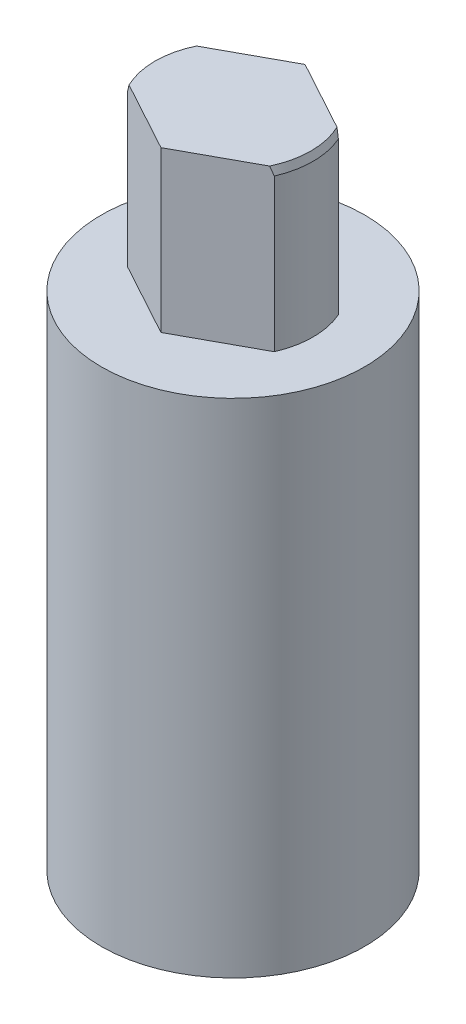
ISO-10303-21;
HEADER;
FILE_DESCRIPTION(('STEP AP214'),'2;1');
FILE_NAME('part.step','',(''),(''),'','','');
FILE_SCHEMA(('AUTOMOTIVE_DESIGN { 1 0 10303 214 1 1 1 1 }'));
ENDSEC;
DATA;
#1=APPLICATION_CONTEXT('core data for automotive mechanical design processes');
#2=APPLICATION_PROTOCOL_DEFINITION('international standard','automotive_design',2000,#1);
#3=PRODUCT_CONTEXT('',#1,'mechanical');
#4=PRODUCT('Part','Part','',(#3));
#5=PRODUCT_RELATED_PRODUCT_CATEGORY('part','',(#4));
#6=PRODUCT_DEFINITION_FORMATION('','',#4);
#7=PRODUCT_DEFINITION_CONTEXT('part definition',#1,'design');
#8=PRODUCT_DEFINITION('design','',#6,#7);
#9=PRODUCT_DEFINITION_SHAPE('','',#8);
#10=(LENGTH_UNIT() NAMED_UNIT(*) SI_UNIT(.MILLI.,.METRE.));
#11=(NAMED_UNIT(*) PLANE_ANGLE_UNIT() SI_UNIT($,.RADIAN.));
#12=(NAMED_UNIT(*) SI_UNIT($,.STERADIAN.) SOLID_ANGLE_UNIT());
#13=UNCERTAINTY_MEASURE_WITH_UNIT(LENGTH_MEASURE(1.E-05),#10,'distance_accuracy_value','');
#14=(GEOMETRIC_REPRESENTATION_CONTEXT(3) GLOBAL_UNCERTAINTY_ASSIGNED_CONTEXT((#13)) GLOBAL_UNIT_ASSIGNED_CONTEXT((#10,
#11,#12)) REPRESENTATION_CONTEXT('',''));
#15=CARTESIAN_POINT('',(0.,0.,0.));
#16=DIRECTION('',(0.,0.,1.));
#17=DIRECTION('',(1.,0.,0.));
#18=AXIS2_PLACEMENT_3D('',#15,#16,#17);
#19=CARTESIAN_POINT('',(0.,20.174241,0.));
#20=DIRECTION('',(0.,-1.,0.));
#21=DIRECTION('',(0.,0.,-1.));
#22=AXIS2_PLACEMENT_3D('',#19,#20,#21);
#23=CYLINDRICAL_SURFACE('',#22,10.0871205);
#24=DIRECTION('',(0.,1.,0.));
#25=VECTOR('',#24,1.);
#26=CARTESIAN_POINT('',(-9.24499864707816,0.,-4.0348482));
#27=LINE('',#26,#25);
#28=CARTESIAN_POINT('',(-9.24499864707816,0.,-4.0348482));
#29=VERTEX_POINT('',#28);
#30=CARTESIAN_POINT('',(-9.24499864707816,19.174241,-4.0348482));
#31=VERTEX_POINT('',#30);
#32=EDGE_CURVE('E131',#29,#31,#27,.T.);
#33=ORIENTED_EDGE('',*,*,#32,.F.);
#34=CARTESIAN_POINT('',(0.,0.,0.));
#35=DIRECTION('',(0.,-1.,0.));
#36=DIRECTION('',(0.,0.,-1.));
#37=AXIS2_PLACEMENT_3D('',#34,#35,#36);
#38=CIRCLE('',#37,10.0871205);
#39=CARTESIAN_POINT('',(-9.24499864707816,0.,4.0348482));
#40=VERTEX_POINT('',#39);
#41=EDGE_CURVE('E125',#40,#29,#38,.T.);
#42=ORIENTED_EDGE('',*,*,#41,.F.);
#43=DIRECTION('',(0.,1.,0.));
#44=VECTOR('',#43,1.);
#45=CARTESIAN_POINT('',(-9.24499864707816,0.,4.0348482));
#46=LINE('',#45,#44);
#47=CARTESIAN_POINT('',(-9.24499864707816,19.174241,4.0348482));
#48=VERTEX_POINT('',#47);
#49=EDGE_CURVE('E108',#40,#48,#46,.T.);
#50=ORIENTED_EDGE('',*,*,#49,.T.);
#51=CARTESIAN_POINT('',(0.,19.174241,0.));
#52=DIRECTION('',(0.,1.,0.));
#53=DIRECTION('',(0.,0.,1.));
#54=AXIS2_PLACEMENT_3D('',#51,#52,#53);
#55=CIRCLE('',#54,10.0871205);
#56=EDGE_CURVE('E145',#48,#31,#55,.F.);
#57=ORIENTED_EDGE('',*,*,#56,.T.);
#58=EDGE_LOOP('',(#33,#42,#50,#57));
#59=FACE_BOUND('',#58,.T.);
#60=ADVANCED_FACE('F38',(#59),#23,.T.);
#61=DIRECTION('',(0.,1.,0.));
#62=VECTOR('',#61,1.);
#63=CARTESIAN_POINT('',(9.24499864707816,0.,-4.0348482));
#64=LINE('',#63,#62);
#65=CARTESIAN_POINT('',(9.24499864707816,0.,-4.0348482));
#66=VERTEX_POINT('',#65);
#67=CARTESIAN_POINT('',(9.24499864707816,19.174241,-4.0348482));
#68=VERTEX_POINT('',#67);
#69=EDGE_CURVE('E191',#66,#68,#64,.T.);
#70=ORIENTED_EDGE('',*,*,#69,.T.);
#71=CARTESIAN_POINT('',(9.24499864707816,19.174241,4.0348482));
#72=VERTEX_POINT('',#71);
#73=EDGE_CURVE('E144',#68,#72,#55,.F.);
#74=ORIENTED_EDGE('',*,*,#73,.T.);
#75=DIRECTION('',(0.,1.,0.));
#76=VECTOR('',#75,1.);
#77=CARTESIAN_POINT('',(9.24499864707816,0.,4.0348482));
#78=LINE('',#77,#76);
#79=CARTESIAN_POINT('',(9.24499864707816,0.,4.0348482));
#80=VERTEX_POINT('',#79);
#81=EDGE_CURVE('E197',#80,#72,#78,.T.);
#82=ORIENTED_EDGE('',*,*,#81,.F.);
#83=EDGE_CURVE('E132',#66,#80,#38,.T.);
#84=ORIENTED_EDGE('',*,*,#83,.F.);
#85=EDGE_LOOP('',(#70,#74,#82,#84));
#86=FACE_BOUND('',#85,.T.);
#87=ADVANCED_FACE('F179',(#86),#23,.T.);
#88=CARTESIAN_POINT('',(0.,20.174241,0.));
#89=DIRECTION('',(0.,1.,0.));
#90=DIRECTION('',(0.,0.,1.));
#91=AXIS2_PLACEMENT_3D('',#88,#89,#90);
#92=PLANE('',#91);
#93=DIRECTION('',(-0.877862290928858,0.,-0.478913142610576));
#94=VECTOR('',#93,1.);
#95=CARTESIAN_POINT('',(9.24499864707816,20.174241,-4.0348482));
#96=LINE('',#95,#94);
#97=CARTESIAN_POINT('',(8.85216261350672,20.174241,-4.24915782613659));
#98=VERTEX_POINT('',#97);
#99=CARTESIAN_POINT('',(0.,20.174241,-9.07840845));
#100=VERTEX_POINT('',#99);
#101=EDGE_CURVE('E67',#98,#100,#96,.T.);
#102=ORIENTED_EDGE('',*,*,#101,.T.);
#103=DIRECTION('',(-0.877862290928858,0.,0.478913142610576));
#104=VECTOR('',#103,1.);
#105=CARTESIAN_POINT('',(-9.24499864707816,20.174241,-4.0348482));
#106=LINE('',#105,#104);
#107=CARTESIAN_POINT('',(-8.85216261350673,20.174241,-4.24915782613658));
#108=VERTEX_POINT('',#107);
#109=EDGE_CURVE('E128',#100,#108,#106,.T.);
#110=ORIENTED_EDGE('',*,*,#109,.T.);
#111=CARTESIAN_POINT('',(0.,20.174241,0.));
#112=DIRECTION('',(0.,1.,0.));
#113=DIRECTION('',(0.,0.,1.));
#114=AXIS2_PLACEMENT_3D('',#111,#112,#113);
#115=CIRCLE('',#114,9.81917130756888);
#116=CARTESIAN_POINT('',(-8.85216261350673,20.174241,4.24915782613659));
#117=VERTEX_POINT('',#116);
#118=EDGE_CURVE('E135',#108,#117,#115,.T.);
#119=ORIENTED_EDGE('',*,*,#118,.T.);
#120=DIRECTION('',(0.877862290928858,0.,0.478913142610576));
#121=VECTOR('',#120,1.);
#122=CARTESIAN_POINT('',(0.,20.174241,9.07840845));
#123=LINE('',#122,#121);
#124=CARTESIAN_POINT('',(0.,20.174241,9.07840845));
#125=VERTEX_POINT('',#124);
#126=EDGE_CURVE('E59',#117,#125,#123,.T.);
#127=ORIENTED_EDGE('',*,*,#126,.T.);
#128=DIRECTION('',(0.877862290928858,0.,-0.478913142610576));
#129=VECTOR('',#128,1.);
#130=CARTESIAN_POINT('',(0.,20.174241,9.07840845));
#131=LINE('',#130,#129);
#132=CARTESIAN_POINT('',(8.85216261350672,20.174241,4.24915782613659));
#133=VERTEX_POINT('',#132);
#134=EDGE_CURVE('E224',#125,#133,#131,.T.);
#135=ORIENTED_EDGE('',*,*,#134,.T.);
#136=EDGE_CURVE('E141',#133,#98,#115,.T.);
#137=ORIENTED_EDGE('',*,*,#136,.T.);
#138=EDGE_LOOP('',(#102,#110,#119,#127,#135,#137));
#139=FACE_BOUND('',#138,.T.);
#140=ADVANCED_FACE('F177',(#139),#92,.T.);
#141=CARTESIAN_POINT('',(0.,20.174241,0.));
#142=DIRECTION('',(0.,-1.,0.));
#143=DIRECTION('',(0.,0.,-1.));
#144=AXIS2_PLACEMENT_3D('',#141,#142,#143);
#145=CONICAL_SURFACE('',#144,9.81917130756888,0.261799387799152);
#146=ORIENTED_EDGE('',*,*,#118,.F.);
#147=CARTESIAN_POINT('',(-8.85208207999155,20.174441,-4.24920176077102));
#148=CARTESIAN_POINT('',(-8.91889550438962,20.0083777009909,-4.21275204949205));
#149=CARTESIAN_POINT('',(-8.98505166783165,19.8419793620903,-4.17666090346098));
#150=CARTESIAN_POINT('',(-9.1160494372309,19.5085126950598,-4.10519576130117));
#151=CARTESIAN_POINT('',(-9.18089104390203,19.3414443672938,-4.06982176478295));
#152=CARTESIAN_POINT('',(-9.24507539033106,19.1740410000003,-4.03480633312316));
#153=B_SPLINE_CURVE_WITH_KNOTS('',3,(#147,#148,#149,#150,#151,#152),.UNSPECIFIED.,.F.,.F.,(4,2,
4),(0.,0.548004145740498,1.09600799385742),.UNSPECIFIED.);
#154=EDGE_CURVE('E12',#108,#31,#153,.T.);
#155=ORIENTED_EDGE('',*,*,#154,.T.);
#156=ORIENTED_EDGE('',*,*,#56,.F.);
#157=CARTESIAN_POINT('',(-9.24507539033058,19.174041,4.03480633312342));
#158=CARTESIAN_POINT('',(-9.1808910439017,19.3414443672936,4.06982176478313));
#159=CARTESIAN_POINT('',(-9.11604943723073,19.5085126950597,4.10519576130126));
#160=CARTESIAN_POINT('',(-8.98505166783183,19.8419793620903,4.17666090346089));
#161=CARTESIAN_POINT('',(-8.91889550438998,20.0083777009911,4.21275204949186));
#162=CARTESIAN_POINT('',(-8.8520820799921,20.1744410000003,4.24920176077072));
#163=B_SPLINE_CURVE_WITH_KNOTS('',3,(#157,#158,#159,#160,#161,#162),.UNSPECIFIED.,.F.,.F.,(4,2,
4),(0.,0.54800384811692,1.09600799385742),.UNSPECIFIED.);
#164=EDGE_CURVE('E112',#48,#117,#163,.T.);
#165=ORIENTED_EDGE('',*,*,#164,.T.);
#166=EDGE_LOOP('',(#146,#155,#156,#165));
#167=FACE_BOUND('',#166,.T.);
#168=ADVANCED_FACE('F40',(#167),#145,.T.);
#169=ORIENTED_EDGE('',*,*,#73,.F.);
#170=CARTESIAN_POINT('',(9.24507539033058,19.174041,-4.03480633312342));
#171=CARTESIAN_POINT('',(9.1808910439017,19.3414443672936,-4.06982176478314));
#172=CARTESIAN_POINT('',(9.11604943723073,19.5085126950597,-4.10519576130127));
#173=CARTESIAN_POINT('',(8.98505166783182,19.8419793620904,-4.17666090346089));
#174=CARTESIAN_POINT('',(8.91889550438997,20.0083777009911,-4.21275204949186));
#175=CARTESIAN_POINT('',(8.8520820799921,20.1744410000003,-4.24920176077072));
#176=B_SPLINE_CURVE_WITH_KNOTS('',3,(#170,#171,#172,#173,#174,#175),.UNSPECIFIED.,.F.,.F.,(4,2,
4),(0.,0.548003848116923,1.09600799385741),.UNSPECIFIED.);
#177=EDGE_CURVE('E52',#68,#98,#176,.T.);
#178=ORIENTED_EDGE('',*,*,#177,.T.);
#179=ORIENTED_EDGE('',*,*,#136,.F.);
#180=CARTESIAN_POINT('',(8.85208207999155,20.174441,4.24920176077103));
#181=CARTESIAN_POINT('',(8.91889550438962,20.0083777009909,4.21275204949206));
#182=CARTESIAN_POINT('',(8.98505166783165,19.8419793620903,4.17666090346099));
#183=CARTESIAN_POINT('',(9.1160494372309,19.5085126950598,4.10519576130117));
#184=CARTESIAN_POINT('',(9.18089104390203,19.3414443672938,4.06982176478296));
#185=CARTESIAN_POINT('',(9.24507539033106,19.1740410000003,4.03480633312316));
#186=B_SPLINE_CURVE_WITH_KNOTS('',3,(#180,#181,#182,#183,#184,#185),.UNSPECIFIED.,.F.,.F.,(4,2,
4),(0.,0.548004145740498,1.09600799385742),.UNSPECIFIED.);
#187=EDGE_CURVE('E153',#133,#72,#186,.T.);
#188=ORIENTED_EDGE('',*,*,#187,.T.);
#189=EDGE_LOOP('',(#169,#178,#179,#188));
#190=FACE_BOUND('',#189,.T.);
#191=ADVANCED_FACE('F172',(#190),#145,.T.);
#192=CARTESIAN_POINT('',(0.,0.,0.));
#193=DIRECTION('',(0.,-1.,0.));
#194=DIRECTION('',(0.,0.,-1.));
#195=AXIS2_PLACEMENT_3D('',#192,#193,#194);
#196=PLANE('',#195);
#197=CARTESIAN_POINT('',(0.,0.,0.));
#198=DIRECTION('',(0.,-1.,0.));
#199=DIRECTION('',(0.,0.,-1.));
#200=AXIS2_PLACEMENT_3D('',#197,#198,#199);
#201=CIRCLE('',#200,16.5871205);
#202=CARTESIAN_POINT('',(0.,0.,-16.5871205));
#203=VERTEX_POINT('',#202);
#204=EDGE_CURVE('E137',#203,#203,#201,.T.);
#205=ORIENTED_EDGE('',*,*,#204,.F.);
#206=EDGE_LOOP('',(#205));
#207=FACE_BOUND('',#206,.T.);
#208=ORIENTED_EDGE('',*,*,#83,.T.);
#209=DIRECTION('',(0.877862290928858,0.,-0.478913142610576));
#210=VECTOR('',#209,1.);
#211=CARTESIAN_POINT('',(0.,0.,9.07840845));
#212=LINE('',#211,#210);
#213=CARTESIAN_POINT('',(0.,0.,9.07840845));
#214=VERTEX_POINT('',#213);
#215=EDGE_CURVE('E126',#214,#80,#212,.T.);
#216=ORIENTED_EDGE('',*,*,#215,.F.);
#217=DIRECTION('',(0.877862290928858,0.,0.478913142610576));
#218=VECTOR('',#217,1.);
#219=CARTESIAN_POINT('',(0.,0.,9.07840845));
#220=LINE('',#219,#218);
#221=EDGE_CURVE('E111',#40,#214,#220,.T.);
#222=ORIENTED_EDGE('',*,*,#221,.F.);
#223=ORIENTED_EDGE('',*,*,#41,.T.);
#224=DIRECTION('',(-0.877862290928858,0.,0.478913142610576));
#225=VECTOR('',#224,1.);
#226=CARTESIAN_POINT('',(-9.24499864707816,0.,-4.0348482));
#227=LINE('',#226,#225);
#228=CARTESIAN_POINT('',(0.,0.,-9.07840845));
#229=VERTEX_POINT('',#228);
#230=EDGE_CURVE('E118',#229,#29,#227,.T.);
#231=ORIENTED_EDGE('',*,*,#230,.F.);
#232=DIRECTION('',(-0.877862290928858,0.,-0.478913142610576));
#233=VECTOR('',#232,1.);
#234=CARTESIAN_POINT('',(9.24499864707816,0.,-4.0348482));
#235=LINE('',#234,#233);
#236=EDGE_CURVE('E234',#66,#229,#235,.T.);
#237=ORIENTED_EDGE('',*,*,#236,.F.);
#238=EDGE_LOOP('',(#208,#216,#222,#223,#231,#237));
#239=FACE_BOUND('',#238,.T.);
#240=ADVANCED_FACE('F123',(#207,#239),#196,.F.);
#241=CARTESIAN_POINT('',(0.,-63.26,0.));
#242=DIRECTION('',(0.,1.,0.));
#243=DIRECTION('',(0.,0.,1.));
#244=AXIS2_PLACEMENT_3D('',#241,#242,#243);
#245=CYLINDRICAL_SURFACE('',#244,16.5871205);
#246=CARTESIAN_POINT('',(0.,-63.26,0.));
#247=DIRECTION('',(0.,-1.,0.));
#248=DIRECTION('',(0.,0.,-1.));
#249=AXIS2_PLACEMENT_3D('',#246,#247,#248);
#250=CIRCLE('',#249,16.5871205);
#251=CARTESIAN_POINT('',(0.,-63.26,-16.5871205));
#252=VERTEX_POINT('',#251);
#253=EDGE_CURVE('E133',#252,#252,#250,.T.);
#254=ORIENTED_EDGE('',*,*,#253,.F.);
#255=EDGE_LOOP('',(#254));
#256=FACE_BOUND('',#255,.T.);
#257=ORIENTED_EDGE('',*,*,#204,.T.);
#258=EDGE_LOOP('',(#257));
#259=FACE_BOUND('',#258,.T.);
#260=ADVANCED_FACE('F168',(#256,#259),#245,.T.);
#261=CARTESIAN_POINT('',(0.,-63.26,0.));
#262=DIRECTION('',(0.,-1.,0.));
#263=DIRECTION('',(0.,0.,-1.));
#264=AXIS2_PLACEMENT_3D('',#261,#262,#263);
#265=PLANE('',#264);
#266=ORIENTED_EDGE('',*,*,#253,.T.);
#267=EDGE_LOOP('',(#266));
#268=FACE_BOUND('',#267,.T.);
#269=ADVANCED_FACE('F163',(#268),#265,.T.);
#270=CARTESIAN_POINT('',(0.,0.,9.07840845));
#271=DIRECTION('',(-0.478913142610576,0.,0.877862290928858));
#272=DIRECTION('',(0.877862290928858,0.,0.478913142610576));
#273=AXIS2_PLACEMENT_3D('',#270,#271,#272);
#274=PLANE('',#273);
#275=ORIENTED_EDGE('',*,*,#49,.F.);
#276=ORIENTED_EDGE('',*,*,#221,.T.);
#277=DIRECTION('',(0.,1.,0.));
#278=VECTOR('',#277,1.);
#279=CARTESIAN_POINT('',(0.,0.,9.07840845));
#280=LINE('',#279,#278);
#281=EDGE_CURVE('E117',#214,#125,#280,.T.);
#282=ORIENTED_EDGE('',*,*,#281,.T.);
#283=ORIENTED_EDGE('',*,*,#126,.F.);
#284=ORIENTED_EDGE('',*,*,#164,.F.);
#285=EDGE_LOOP('',(#275,#276,#282,#283,#284));
#286=FACE_BOUND('',#285,.T.);
#287=ADVANCED_FACE('F110',(#286),#274,.T.);
#288=CARTESIAN_POINT('',(0.,0.,9.07840845));
#289=DIRECTION('',(0.478913142610576,0.,0.877862290928858));
#290=DIRECTION('',(0.877862290928858,0.,-0.478913142610576));
#291=AXIS2_PLACEMENT_3D('',#288,#289,#290);
#292=PLANE('',#291);
#293=ORIENTED_EDGE('',*,*,#134,.F.);
#294=ORIENTED_EDGE('',*,*,#281,.F.);
#295=ORIENTED_EDGE('',*,*,#215,.T.);
#296=ORIENTED_EDGE('',*,*,#81,.T.);
#297=ORIENTED_EDGE('',*,*,#187,.F.);
#298=EDGE_LOOP('',(#293,#294,#295,#296,#297));
#299=FACE_BOUND('',#298,.T.);
#300=ADVANCED_FACE('F162',(#299),#292,.T.);
#301=CARTESIAN_POINT('',(-9.24499864707816,0.,-4.0348482));
#302=DIRECTION('',(-0.478913142610576,0.,-0.877862290928858));
#303=DIRECTION('',(-0.877862290928858,0.,0.478913142610576));
#304=AXIS2_PLACEMENT_3D('',#301,#302,#303);
#305=PLANE('',#304);
#306=ORIENTED_EDGE('',*,*,#109,.F.);
#307=DIRECTION('',(0.,1.,0.));
#308=VECTOR('',#307,1.);
#309=CARTESIAN_POINT('',(0.,0.,-9.07840845));
#310=LINE('',#309,#308);
#311=EDGE_CURVE('E196',#229,#100,#310,.T.);
#312=ORIENTED_EDGE('',*,*,#311,.F.);
#313=ORIENTED_EDGE('',*,*,#230,.T.);
#314=ORIENTED_EDGE('',*,*,#32,.T.);
#315=ORIENTED_EDGE('',*,*,#154,.F.);
#316=EDGE_LOOP('',(#306,#312,#313,#314,#315));
#317=FACE_BOUND('',#316,.T.);
#318=ADVANCED_FACE('F212',(#317),#305,.T.);
#319=CARTESIAN_POINT('',(9.24499864707816,0.,-4.0348482));
#320=DIRECTION('',(0.478913142610576,0.,-0.877862290928858));
#321=DIRECTION('',(-0.877862290928858,0.,-0.478913142610576));
#322=AXIS2_PLACEMENT_3D('',#319,#320,#321);
#323=PLANE('',#322);
#324=ORIENTED_EDGE('',*,*,#69,.F.);
#325=ORIENTED_EDGE('',*,*,#236,.T.);
#326=ORIENTED_EDGE('',*,*,#311,.T.);
#327=ORIENTED_EDGE('',*,*,#101,.F.);
#328=ORIENTED_EDGE('',*,*,#177,.F.);
#329=EDGE_LOOP('',(#324,#325,#326,#327,#328));
#330=FACE_BOUND('',#329,.T.);
#331=ADVANCED_FACE('F209',(#330),#323,.T.);
#332=CLOSED_SHELL('',(#60,#87,#140,#168,#191,#240,#260,#269,#287,#300,#318,#331));
#333=MANIFOLD_SOLID_BREP('B2',#332);
#334=ADVANCED_BREP_SHAPE_REPRESENTATION('',(#18,#333),#14);
#335=SHAPE_DEFINITION_REPRESENTATION(#9,#334);
ENDSEC;
END-ISO-10303-21;
